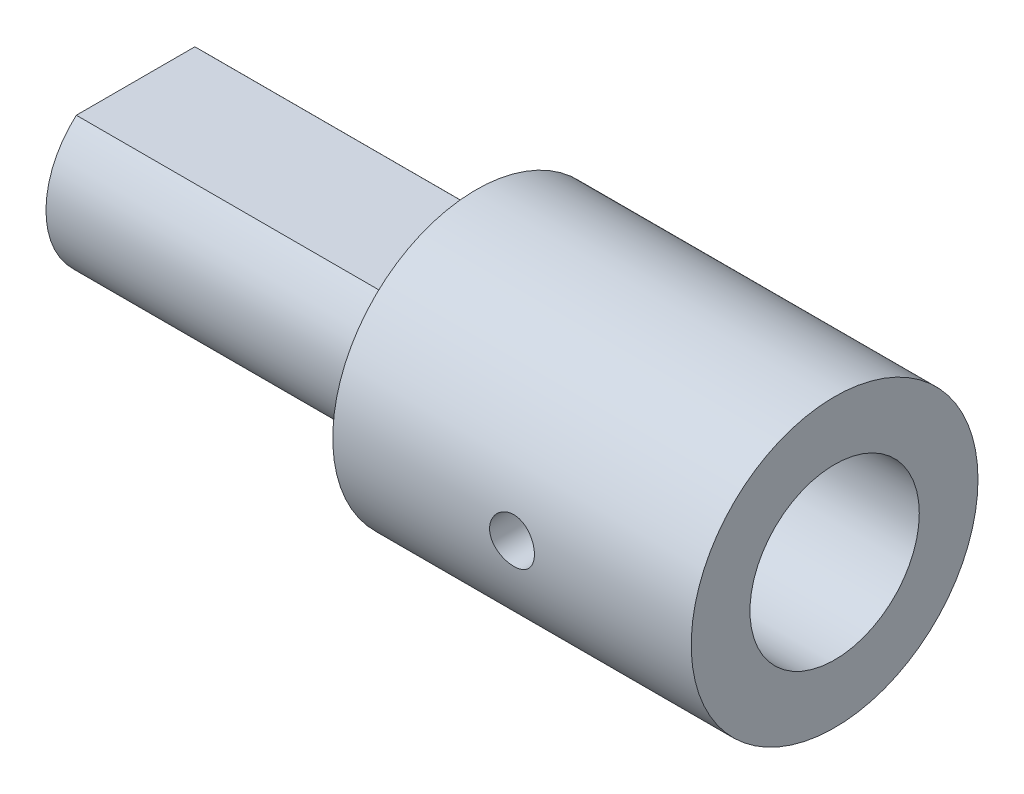
ISO-10303-21;
HEADER;
FILE_DESCRIPTION(('STEP AP214'),'2;1');
FILE_NAME('part.step','',(''),(''),'','','');
FILE_SCHEMA(('AUTOMOTIVE_DESIGN { 1 0 10303 214 1 1 1 1 }'));
ENDSEC;
DATA;
#1=APPLICATION_CONTEXT('core data for automotive mechanical design processes');
#2=APPLICATION_PROTOCOL_DEFINITION('international standard','automotive_design',2000,#1);
#3=PRODUCT_CONTEXT('',#1,'mechanical');
#4=PRODUCT('Part','Part','',(#3));
#5=PRODUCT_RELATED_PRODUCT_CATEGORY('part','',(#4));
#6=PRODUCT_DEFINITION_FORMATION('','',#4);
#7=PRODUCT_DEFINITION_CONTEXT('part definition',#1,'design');
#8=PRODUCT_DEFINITION('design','',#6,#7);
#9=PRODUCT_DEFINITION_SHAPE('','',#8);
#10=(LENGTH_UNIT() NAMED_UNIT(*) SI_UNIT(.MILLI.,.METRE.));
#11=(NAMED_UNIT(*) PLANE_ANGLE_UNIT() SI_UNIT($,.RADIAN.));
#12=(NAMED_UNIT(*) SI_UNIT($,.STERADIAN.) SOLID_ANGLE_UNIT());
#13=UNCERTAINTY_MEASURE_WITH_UNIT(LENGTH_MEASURE(1.E-05),#10,'distance_accuracy_value','');
#14=(GEOMETRIC_REPRESENTATION_CONTEXT(3) GLOBAL_UNCERTAINTY_ASSIGNED_CONTEXT((#13)) GLOBAL_UNIT_ASSIGNED_CONTEXT((#10,
#11,#12)) REPRESENTATION_CONTEXT('',''));
#15=CARTESIAN_POINT('',(0.,0.,0.));
#16=DIRECTION('',(0.,0.,1.));
#17=DIRECTION('',(1.,0.,0.));
#18=AXIS2_PLACEMENT_3D('',#15,#16,#17);
#19=CARTESIAN_POINT('',(12.7,0.,0.));
#20=DIRECTION('',(-1.,0.,0.));
#21=DIRECTION('',(0.,0.,1.));
#22=AXIS2_PLACEMENT_3D('',#19,#20,#21);
#23=CYLINDRICAL_SURFACE('',#22,5.08);
#24=CARTESIAN_POINT('',(12.7,0.,0.));
#25=DIRECTION('',(1.,0.,0.));
#26=DIRECTION('',(0.,0.,-1.));
#27=AXIS2_PLACEMENT_3D('',#24,#25,#26);
#28=CIRCLE('',#27,5.08);
#29=CARTESIAN_POINT('',(12.7,0.,-5.08));
#30=VERTEX_POINT('',#29);
#31=EDGE_CURVE('E53',#30,#30,#28,.T.);
#32=ORIENTED_EDGE('',*,*,#31,.F.);
#33=EDGE_LOOP('',(#32));
#34=FACE_BOUND('',#33,.T.);
#35=CARTESIAN_POINT('',(0.,0.,0.));
#36=DIRECTION('',(1.,0.,0.));
#37=DIRECTION('',(0.,0.,-1.));
#38=AXIS2_PLACEMENT_3D('',#35,#36,#37);
#39=CIRCLE('',#38,5.08);
#40=CARTESIAN_POINT('',(0.,0.,-5.08));
#41=VERTEX_POINT('',#40);
#42=EDGE_CURVE('E99',#41,#41,#39,.T.);
#43=ORIENTED_EDGE('',*,*,#42,.T.);
#44=EDGE_LOOP('',(#43));
#45=FACE_BOUND('',#44,.T.);
#46=CARTESIAN_POINT('',(5.55625,0.,-5.08));
#47=CARTESIAN_POINT('',(5.55625180920121,0.044296043383553,-5.07999927036749));
#48=CARTESIAN_POINT('',(5.5599705011231,0.0886172360448611,-5.07941456964222));
#49=CARTESIAN_POINT('',(5.57474237198037,0.176019242505547,-5.07713836645986));
#50=CARTESIAN_POINT('',(5.58580254836986,0.219098831970153,-5.075445808082));
#51=CARTESIAN_POINT('',(5.6149175429411,0.302740230830051,-5.07114396350134));
#52=CARTESIAN_POINT('',(5.63296691583231,0.343303971852044,-5.06853539111307));
#53=CARTESIAN_POINT('',(5.67553428808246,0.42082124720666,-5.06268924607114));
#54=CARTESIAN_POINT('',(5.70005144691391,0.457775249791938,-5.0594517551636));
#55=CARTESIAN_POINT('',(5.75507899285238,0.527342071949389,-5.05267680221558));
#56=CARTESIAN_POINT('',(5.78563327087765,0.55991997462779,-5.04913725817067));
#57=CARTESIAN_POINT('',(5.85177326857537,0.619508441012464,-5.04217329171366));
#58=CARTESIAN_POINT('',(5.88735928739281,0.64651867347706,-5.03874887616113));
#59=CARTESIAN_POINT('',(5.96278915115163,0.694342478244206,-5.03238270930464));
#60=CARTESIAN_POINT('',(6.00265483564987,0.715121993546623,-5.02944364882088));
#61=CARTESIAN_POINT('',(6.08536419794735,0.749676814070682,-5.02440956553201));
#62=CARTESIAN_POINT('',(6.1282076992721,0.763452533956951,-5.02231449275954));
#63=CARTESIAN_POINT('',(6.21528821111315,0.78349970084788,-5.01922616457254));
#64=CARTESIAN_POINT('',(6.25951109849747,0.789831114922799,-5.01822410924025));
#65=CARTESIAN_POINT('',(6.34840208247341,0.794995773980448,-5.01740859315288));
#66=CARTESIAN_POINT('',(6.39307015118047,0.79382948568198,-5.01759505841447));
#67=CARTESIAN_POINT('',(6.48115830761323,0.784080794068226,-5.01912747269528));
#68=CARTESIAN_POINT('',(6.52458601841462,0.775565387397026,-5.0204629466872));
#69=CARTESIAN_POINT('',(6.60938861201909,0.751465152622161,-5.02412652889688));
#70=CARTESIAN_POINT('',(6.65076343220337,0.735880109022119,-5.02645466737286));
#71=CARTESIAN_POINT('',(6.730488416275,0.698013961314295,-5.03185273426342));
#72=CARTESIAN_POINT('',(6.76882497888795,0.675704682101867,-5.034925773052));
#73=CARTESIAN_POINT('',(6.84123585258016,0.625043384615573,-5.04146517152656));
#74=CARTESIAN_POINT('',(6.87530986025177,0.596690936578328,-5.04493155917757));
#75=CARTESIAN_POINT('',(6.93861650330608,0.534381357010907,-5.05191327134025));
#76=CARTESIAN_POINT('',(6.96779250275055,0.500366666779711,-5.055428718293));
#77=CARTESIAN_POINT('',(7.02003077374067,0.427893780792947,-5.06207752297935));
#78=CARTESIAN_POINT('',(7.04309301422929,0.389435562466319,-5.06521087877192));
#79=CARTESIAN_POINT('',(7.08245283831161,0.309116706840436,-5.07074614191084));
#80=CARTESIAN_POINT('',(7.09874582233423,0.267253779131346,-5.07314755162064));
#81=CARTESIAN_POINT('',(7.1240541946645,0.181339977266221,-5.07694425300215));
#82=CARTESIAN_POINT('',(7.13307011726611,0.137289263993186,-5.0783396185385));
#83=CARTESIAN_POINT('',(7.14349259527294,0.0487388969224856,-5.07995717473411));
#84=CARTESIAN_POINT('',(7.14497697207494,0.00424861402901249,-5.08019136294233));
#85=CARTESIAN_POINT('',(7.14050111605583,-0.0843453184856967,-5.07949290960978));
#86=CARTESIAN_POINT('',(7.13454113392796,-0.128448981076237,-5.07856030736137));
#87=CARTESIAN_POINT('',(7.11541046191154,-0.214780319189361,-5.07564048272598));
#88=CARTESIAN_POINT('',(7.10227790924999,-0.257016650702793,-5.07365883988385));
#89=CARTESIAN_POINT('',(7.06921525752838,-0.338688066544479,-5.0688623402953));
#90=CARTESIAN_POINT('',(7.04928481604445,-0.378123009640012,-5.06604744157698));
#91=CARTESIAN_POINT('',(7.00301114281731,-0.453412924214505,-5.0598672384525));
#92=CARTESIAN_POINT('',(6.97661881912127,-0.489237376801332,-5.05649778850636));
#93=CARTESIAN_POINT('',(6.91823861272428,-0.555976461412284,-5.04959582047458));
#94=CARTESIAN_POINT('',(6.88625037555246,-0.586890782169281,-5.04606329206925));
#95=CARTESIAN_POINT('',(6.81723896988353,-0.643217156465993,-5.03919498742886));
#96=CARTESIAN_POINT('',(6.78017286103866,-0.668576890504601,-5.0358612807808));
#97=CARTESIAN_POINT('',(6.70226114661253,-0.712709927532083,-5.0298054496585));
#98=CARTESIAN_POINT('',(6.66141564987209,-0.731483420120483,-5.02708330757984));
#99=CARTESIAN_POINT('',(6.57725708907324,-0.761831000925358,-5.02257400154373));
#100=CARTESIAN_POINT('',(6.53395395366691,-0.773432079459621,-5.02078333645795));
#101=CARTESIAN_POINT('',(6.44598369688669,-0.7891910874787,-5.01833061064152));
#102=CARTESIAN_POINT('',(6.40131667872947,-0.793349578794866,-5.01766846472059));
#103=CARTESIAN_POINT('',(6.31240840769938,-0.794091162293151,-5.01755110929251));
#104=CARTESIAN_POINT('',(6.26816783672361,-0.79075654824125,-5.01808278843621));
#105=CARTESIAN_POINT('',(6.18088511815669,-0.776783508837485,-5.02026459414031));
#106=CARTESIAN_POINT('',(6.13784296797071,-0.766145099301102,-5.02191471827885));
#107=CARTESIAN_POINT('',(6.05420499004163,-0.737896447406629,-5.02614275711433));
#108=CARTESIAN_POINT('',(6.01360701065295,-0.720292443519994,-5.02871984142707));
#109=CARTESIAN_POINT('',(5.93592741765778,-0.678620590134874,-5.03451235935048));
#110=CARTESIAN_POINT('',(5.89884594349342,-0.654552484456312,-5.03772781825938));
#111=CARTESIAN_POINT('',(5.82883468973973,-0.600338550841577,-5.04447672869293));
#112=CARTESIAN_POINT('',(5.79595227757511,-0.570131915025889,-5.04801314868392));
#113=CARTESIAN_POINT('',(5.73569425744721,-0.504626862976297,-5.05498113855933));
#114=CARTESIAN_POINT('',(5.70831992744708,-0.469327268349022,-5.05841268395489));
#115=CARTESIAN_POINT('',(5.65970698668748,-0.394387977682784,-5.06480795030002));
#116=CARTESIAN_POINT('',(5.63850619414882,-0.354723500655205,-5.0677687393161));
#117=CARTESIAN_POINT('',(5.60309998370874,-0.272367972648596,-5.07286024998845));
#118=CARTESIAN_POINT('',(5.58888742121271,-0.229680064064709,-5.07499181895123));
#119=CARTESIAN_POINT('',(5.57103501580374,-0.155674771171931,-5.077705890621));
#120=CARTESIAN_POINT('',(5.56549925422529,-0.12481102026939,-5.07856169841294));
#121=CARTESIAN_POINT('',(5.55810613250214,-0.0626357008175593,-5.07970900711495));
#122=CARTESIAN_POINT('',(5.55624872061555,-0.0313241385736949,-5.08000051596279));
#123=CARTESIAN_POINT('',(5.55625,0.,-5.08));
#124=B_SPLINE_CURVE_WITH_KNOTS('',3,(#46,#47,#48,#49,#50,#51,#52,#53,#54,#55,#56,#57,#58,#59,
#60,#61,#62,#63,#64,#65,#66,#67,#68,#69,#70,#71,#72,#73,#74,#75,#76,#77,#78,#79,#80,#81,#82,#83,
#84,#85,#86,#87,#88,#89,#90,#91,#92,#93,#94,#95,#96,#97,#98,#99,#100,#101,#102,#103,#104,#105,
#106,#107,#108,#109,#110,#111,#112,#113,#114,#115,#116,#117,#118,#119,#120,#121,#122,#123),
.UNSPECIFIED.,.T.,.F.,(4,2,2,2,2,2,2,2,2,2,2,2,2,2,2,2,2,2,2,2,2,2,2,2,2,2,2,2,2,2,2,2,2,2,2,2,
2,2,4),(0.,0.132773655101603,0.265674044002645,0.398471097722526,0.531250902164696,
0.665034128883234,0.798825312574214,0.933334997073286,1.06783671690433,1.20124737885361,
1.33464973630398,1.46684865387169,1.59905160139209,1.73181637825245,1.86459059990732,
1.99880770016161,2.1330254822064,2.26733431392074,2.40163328355982,2.53454171146878,
2.66744566372753,2.7996497371021,2.93186047085595,3.06510861916621,3.1983652110845,
3.33282759979245,3.46728611738551,3.60123552800454,3.73517482652801,3.86765032157584,
4.000125529765,4.13248235911901,4.26484443470653,4.39858788910184,4.5323623384268,
4.6669398158345,4.80137941695869,4.89527220191614,4.9891636661114),.UNSPECIFIED.);
#125=CARTESIAN_POINT('',(5.55625,0.,-5.08));
#126=VERTEX_POINT('',#125);
#127=EDGE_CURVE('E91',#126,#126,#124,.T.);
#128=ORIENTED_EDGE('',*,*,#127,.F.);
#129=EDGE_LOOP('',(#128));
#130=FACE_BOUND('',#129,.T.);
#131=CARTESIAN_POINT('',(7.14375,0.,5.08));
#132=CARTESIAN_POINT('',(7.14374819079879,0.044296043383553,5.07999927036749));
#133=CARTESIAN_POINT('',(7.14002949887689,0.0886172360448612,5.07941456964222));
#134=CARTESIAN_POINT('',(7.12525762801963,0.176019242505547,5.07713836645986));
#135=CARTESIAN_POINT('',(7.11419745163013,0.219098831970153,5.075445808082));
#136=CARTESIAN_POINT('',(7.0850824570589,0.302740230830051,5.07114396350134));
#137=CARTESIAN_POINT('',(7.06703308416769,0.343303971852044,5.06853539111307));
#138=CARTESIAN_POINT('',(7.02446571191754,0.42082124720666,5.06268924607114));
#139=CARTESIAN_POINT('',(6.99994855308609,0.457775249791937,5.0594517551636));
#140=CARTESIAN_POINT('',(6.94492100714762,0.527342071949389,5.05267680221558));
#141=CARTESIAN_POINT('',(6.91436672912235,0.55991997462779,5.04913725817067));
#142=CARTESIAN_POINT('',(6.84822673142463,0.619508441012464,5.04217329171366));
#143=CARTESIAN_POINT('',(6.81264071260719,0.64651867347706,5.03874887616113));
#144=CARTESIAN_POINT('',(6.73721084884837,0.694342478244206,5.03238270930464));
#145=CARTESIAN_POINT('',(6.69734516435013,0.715121993546623,5.02944364882088));
#146=CARTESIAN_POINT('',(6.61463580205265,0.749676814070682,5.02440956553201));
#147=CARTESIAN_POINT('',(6.5717923007279,0.763452533956951,5.02231449275954));
#148=CARTESIAN_POINT('',(6.48471178888685,0.78349970084788,5.01922616457254));
#149=CARTESIAN_POINT('',(6.44048890150253,0.789831114922799,5.01822410924025));
#150=CARTESIAN_POINT('',(6.35159791752658,0.794995773980448,5.01740859315288));
#151=CARTESIAN_POINT('',(6.30692984881953,0.79382948568198,5.01759505841447));
#152=CARTESIAN_POINT('',(6.21884169238677,0.784080794068226,5.01912747269528));
#153=CARTESIAN_POINT('',(6.17541398158538,0.775565387397026,5.0204629466872));
#154=CARTESIAN_POINT('',(6.09061138798092,0.751465152622161,5.02412652889688));
#155=CARTESIAN_POINT('',(6.04923656779663,0.73588010902212,5.02645466737286));
#156=CARTESIAN_POINT('',(5.969511583725,0.698013961314296,5.03185273426342));
#157=CARTESIAN_POINT('',(5.93117502111205,0.675704682101868,5.034925773052));
#158=CARTESIAN_POINT('',(5.85876414741984,0.625043384615573,5.04146517152656));
#159=CARTESIAN_POINT('',(5.82469013974823,0.596690936578328,5.04493155917757));
#160=CARTESIAN_POINT('',(5.76138349669392,0.534381357010907,5.05191327134025));
#161=CARTESIAN_POINT('',(5.73220749724945,0.500366666779712,5.055428718293));
#162=CARTESIAN_POINT('',(5.67996922625933,0.427893780792947,5.06207752297935));
#163=CARTESIAN_POINT('',(5.65690698577071,0.389435562466319,5.06521087877192));
#164=CARTESIAN_POINT('',(5.61754716168839,0.309116706840436,5.07074614191084));
#165=CARTESIAN_POINT('',(5.60125417766577,0.267253779131346,5.07314755162064));
#166=CARTESIAN_POINT('',(5.5759458053355,0.181339977266221,5.07694425300215));
#167=CARTESIAN_POINT('',(5.56692988273389,0.137289263993186,5.0783396185385));
#168=CARTESIAN_POINT('',(5.55650740472706,0.0487388969224857,5.07995717473411));
#169=CARTESIAN_POINT('',(5.55502302792506,0.00424861402901268,5.08019136294233));
#170=CARTESIAN_POINT('',(5.55949888394417,-0.0843453184856964,5.07949290960978));
#171=CARTESIAN_POINT('',(5.56545886607204,-0.128448981076237,5.07856030736137));
#172=CARTESIAN_POINT('',(5.58458953808846,-0.214780319189361,5.07564048272598));
#173=CARTESIAN_POINT('',(5.59772209075,-0.257016650702793,5.07365883988385));
#174=CARTESIAN_POINT('',(5.63078474247162,-0.338688066544479,5.0688623402953));
#175=CARTESIAN_POINT('',(5.65071518395555,-0.378123009640012,5.06604744157698));
#176=CARTESIAN_POINT('',(5.69698885718269,-0.453412924214504,5.0598672384525));
#177=CARTESIAN_POINT('',(5.72338118087873,-0.489237376801332,5.05649778850636));
#178=CARTESIAN_POINT('',(5.78176138727572,-0.555976461412284,5.04959582047458));
#179=CARTESIAN_POINT('',(5.81374962444754,-0.586890782169281,5.04606329206925));
#180=CARTESIAN_POINT('',(5.88276103011646,-0.643217156465993,5.03919498742886));
#181=CARTESIAN_POINT('',(5.91982713896134,-0.668576890504601,5.0358612807808));
#182=CARTESIAN_POINT('',(5.99773885338747,-0.712709927532083,5.0298054496585));
#183=CARTESIAN_POINT('',(6.03858435012791,-0.731483420120483,5.02708330757984));
#184=CARTESIAN_POINT('',(6.12274291092676,-0.761831000925358,5.02257400154373));
#185=CARTESIAN_POINT('',(6.16604604633309,-0.773432079459621,5.02078333645795));
#186=CARTESIAN_POINT('',(6.25401630311331,-0.7891910874787,5.01833061064152));
#187=CARTESIAN_POINT('',(6.29868332127054,-0.793349578794866,5.01766846472059));
#188=CARTESIAN_POINT('',(6.38759159230062,-0.79409116229315,5.01755110929251));
#189=CARTESIAN_POINT('',(6.43183216327639,-0.79075654824125,5.01808278843621));
#190=CARTESIAN_POINT('',(6.51911488184331,-0.776783508837485,5.02026459414031));
#191=CARTESIAN_POINT('',(6.56215703202929,-0.766145099301102,5.02191471827885));
#192=CARTESIAN_POINT('',(6.64579500995836,-0.737896447406629,5.02614275711433));
#193=CARTESIAN_POINT('',(6.68639298934705,-0.720292443519994,5.02871984142707));
#194=CARTESIAN_POINT('',(6.76407258234222,-0.678620590134874,5.03451235935048));
#195=CARTESIAN_POINT('',(6.80115405650658,-0.654552484456312,5.03772781825938));
#196=CARTESIAN_POINT('',(6.87116531026027,-0.600338550841577,5.04447672869293));
#197=CARTESIAN_POINT('',(6.90404772242489,-0.570131915025889,5.04801314868392));
#198=CARTESIAN_POINT('',(6.96430574255279,-0.504626862976297,5.05498113855933));
#199=CARTESIAN_POINT('',(6.99168007255292,-0.469327268349023,5.05841268395489));
#200=CARTESIAN_POINT('',(7.04029301331252,-0.394387977682784,5.06480795030002));
#201=CARTESIAN_POINT('',(7.06149380585118,-0.354723500655206,5.0677687393161));
#202=CARTESIAN_POINT('',(7.09690001629126,-0.272367972648596,5.07286024998845));
#203=CARTESIAN_POINT('',(7.11111257878729,-0.229680064064709,5.07499181895123));
#204=CARTESIAN_POINT('',(7.12896498419626,-0.155674771171931,5.077705890621));
#205=CARTESIAN_POINT('',(7.13450074577471,-0.124811020269391,5.07856169841294));
#206=CARTESIAN_POINT('',(7.14189386749786,-0.0626357008175595,5.07970900711495));
#207=CARTESIAN_POINT('',(7.14375127938445,-0.031324138573695,5.08000051596279));
#208=CARTESIAN_POINT('',(7.14375,0.,5.08));
#209=B_SPLINE_CURVE_WITH_KNOTS('',3,(#131,#132,#133,#134,#135,#136,#137,#138,#139,#140,#141,
#142,#143,#144,#145,#146,#147,#148,#149,#150,#151,#152,#153,#154,#155,#156,#157,#158,#159,#160,
#161,#162,#163,#164,#165,#166,#167,#168,#169,#170,#171,#172,#173,#174,#175,#176,#177,#178,#179,
#180,#181,#182,#183,#184,#185,#186,#187,#188,#189,#190,#191,#192,#193,#194,#195,#196,#197,#198,
#199,#200,#201,#202,#203,#204,#205,#206,#207,#208),.UNSPECIFIED.,.T.,.F.,(4,2,2,2,2,2,2,2,2,2,2,
2,2,2,2,2,2,2,2,2,2,2,2,2,2,2,2,2,2,2,2,2,2,2,2,2,2,2,4),(0.,0.132773655101604,
0.265674044002644,0.398471097722526,0.531250902164695,0.665034128883233,0.798825312574213,
0.933334997073285,1.06783671690433,1.20124737885361,1.33464973630398,1.46684865387169,
1.59905160139208,1.73181637825245,1.86459059990732,1.99880770016161,2.1330254822064,
2.26733431392074,2.40163328355982,2.53454171146878,2.66744566372753,2.7996497371021,
2.93186047085595,3.06510861916621,3.19836521108449,3.33282759979245,3.46728611738551,
3.60123552800454,3.73517482652801,3.86765032157584,4.00012552976499,4.13248235911901,
4.26484443470653,4.39858788910184,4.5323623384268,4.6669398158345,4.80137941695869,
4.89527220191614,4.9891636661114),.UNSPECIFIED.);
#210=CARTESIAN_POINT('',(7.14375,0.,5.08));
#211=VERTEX_POINT('',#210);
#212=EDGE_CURVE('E85',#211,#211,#209,.T.);
#213=ORIENTED_EDGE('',*,*,#212,.F.);
#214=EDGE_LOOP('',(#213));
#215=FACE_BOUND('',#214,.T.);
#216=ADVANCED_FACE('F39',(#34,#45,#130,#215),#23,.T.);
#217=CARTESIAN_POINT('',(3.158744,0.,0.));
#218=DIRECTION('',(1.,0.,0.));
#219=DIRECTION('',(0.,0.,-1.));
#220=AXIS2_PLACEMENT_3D('',#217,#218,#219);
#221=CYLINDRICAL_SURFACE('',#220,2.999994);
#222=CARTESIAN_POINT('',(3.158744,0.,0.));
#223=DIRECTION('',(1.,0.,0.));
#224=DIRECTION('',(0.,0.,-1.));
#225=AXIS2_PLACEMENT_3D('',#222,#223,#224);
#226=CIRCLE('',#225,2.999994);
#227=CARTESIAN_POINT('',(3.158744,0.,-2.999994));
#228=VERTEX_POINT('',#227);
#229=EDGE_CURVE('E88',#228,#228,#226,.T.);
#230=ORIENTED_EDGE('',*,*,#229,.F.);
#231=EDGE_LOOP('',(#230));
#232=FACE_BOUND('',#231,.T.);
#233=CARTESIAN_POINT('',(12.7,0.,0.));
#234=DIRECTION('',(1.,0.,0.));
#235=DIRECTION('',(0.,0.,-1.));
#236=AXIS2_PLACEMENT_3D('',#233,#234,#235);
#237=CIRCLE('',#236,2.999994);
#238=CARTESIAN_POINT('',(12.7,0.,-2.999994));
#239=VERTEX_POINT('',#238);
#240=EDGE_CURVE('E84',#239,#239,#237,.T.);
#241=ORIENTED_EDGE('',*,*,#240,.T.);
#242=EDGE_LOOP('',(#241));
#243=FACE_BOUND('',#242,.T.);
#244=CARTESIAN_POINT('',(5.55625,0.,2.999994));
#245=CARTESIAN_POINT('',(5.55625106465804,0.0437698343876581,2.99999332822944));
#246=CARTESIAN_POINT('',(5.55988254946458,0.0875511375503751,2.99902665718826));
#247=CARTESIAN_POINT('',(5.57428733745207,0.173853354841968,2.99526426791833));
#248=CARTESIAN_POINT('',(5.58506415558185,0.216373637886627,2.99246764950653));
#249=CARTESIAN_POINT('',(5.61338533498128,0.298895534971637,2.98535416780944));
#250=CARTESIAN_POINT('',(5.63092104685117,0.338900292350397,2.98103924811612));
#251=CARTESIAN_POINT('',(5.67223038299155,0.415400922118462,2.97134562505494));
#252=CARTESIAN_POINT('',(5.69600439713904,0.451896575003376,2.96596685520452));
#253=CARTESIAN_POINT('',(5.7496892028934,0.521177160861767,2.95458920610509));
#254=CARTESIAN_POINT('',(5.77971603020188,0.553870461930971,2.94857985780222));
#255=CARTESIAN_POINT('',(5.84480601295341,0.613821027473368,2.93668586148387));
#256=CARTESIAN_POINT('',(5.87986980516324,0.641077603600475,2.93080122934295));
#257=CARTESIAN_POINT('',(5.95476724402217,0.689825755857821,2.91971605484281));
#258=CARTESIAN_POINT('',(5.9946713946475,0.711212290266212,2.91452873166006));
#259=CARTESIAN_POINT('',(6.07766836619235,0.746936836031448,2.90557926803191));
#260=CARTESIAN_POINT('',(6.12076060767194,0.761276124631699,2.90181686936144));
#261=CARTESIAN_POINT('',(6.20789663386639,0.782181625812209,2.89625127268942));
#262=CARTESIAN_POINT('',(6.25189787032209,0.788913797567134,2.89440631820569));
#263=CARTESIAN_POINT('',(6.3404409112413,0.794931306071651,2.89275971527182));
#264=CARTESIAN_POINT('',(6.38498261489509,0.794218010879066,2.89295769144593));
#265=CARTESIAN_POINT('',(6.47204988100888,0.785496672330232,2.89533718831552));
#266=CARTESIAN_POINT('',(6.51459724504645,0.777689050284633,2.89746420862135));
#267=CARTESIAN_POINT('',(6.59775555375415,0.755321523518437,2.90337491900023));
#268=CARTESIAN_POINT('',(6.63836634553002,0.740761086626718,2.90715873963993));
#269=CARTESIAN_POINT('',(6.71702306018244,0.705136977835531,2.91600490122621));
#270=CARTESIAN_POINT('',(6.75503540441127,0.684002726997189,2.92108100369186));
#271=CARTESIAN_POINT('',(6.82704474727299,0.635880167921664,2.93193233507327));
#272=CARTESIAN_POINT('',(6.86104096464763,0.608890723558934,2.93770769957567));
#273=CARTESIAN_POINT('',(6.92519856105347,0.548797422769156,2.94953401104792));
#274=CARTESIAN_POINT('',(6.95520188324837,0.515525155991986,2.95558785435231));
#275=CARTESIAN_POINT('',(7.00923499184325,0.444347564169448,2.96712270428321));
#276=CARTESIAN_POINT('',(7.03326455001538,0.40644206219368,2.972603689019));
#277=CARTESIAN_POINT('',(7.07473611311596,0.326831702122514,2.98240811594882));
#278=CARTESIAN_POINT('',(7.09214989154592,0.285111486243936,2.98672657586602));
#279=CARTESIAN_POINT('',(7.11967120772692,0.199195455930693,2.99368334214618));
#280=CARTESIAN_POINT('',(7.12978031636278,0.155000175967953,2.99632200973751));
#281=CARTESIAN_POINT('',(7.14215803359275,0.066737762443701,2.99956740695457));
#282=CARTESIAN_POINT('',(7.14464157763479,0.0227027731406188,3.00022982386185));
#283=CARTESIAN_POINT('',(7.142290717585,-0.0651543981732737,2.99960799559473));
#284=CARTESIAN_POINT('',(7.13745705722824,-0.108976601357916,2.99832394826276));
#285=CARTESIAN_POINT('',(7.12078541111469,-0.194399708813835,2.99398940155453));
#286=CARTESIAN_POINT('',(7.10906697246559,-0.23602561561469,2.99096906980475));
#287=CARTESIAN_POINT('',(7.0790969454627,-0.316717003965162,2.98350426240148));
#288=CARTESIAN_POINT('',(7.06084465485578,-0.355782209758529,2.97905963367108));
#289=CARTESIAN_POINT('',(7.01792408066594,-0.431081005750425,2.96910839235786));
#290=CARTESIAN_POINT('',(6.99313842600533,-0.467245134931729,2.96358288587735));
#291=CARTESIAN_POINT('',(6.93800256612171,-0.53497645123567,2.95210878065002));
#292=CARTESIAN_POINT('',(6.90765127950869,-0.566542742866242,2.94616009981907));
#293=CARTESIAN_POINT('',(6.84124329066759,-0.625085500454536,2.93430577386352));
#294=CARTESIAN_POINT('',(6.80505172062974,-0.651910424893503,2.92840589594278));
#295=CARTESIAN_POINT('',(6.72855643976503,-0.699109073469396,2.91749885148153));
#296=CARTESIAN_POINT('',(6.68825290260094,-0.719483069902605,2.91249164726481));
#297=CARTESIAN_POINT('',(6.60488128009743,-0.753048141388213,2.90399421782314));
#298=CARTESIAN_POINT('',(6.56183096443205,-0.766281006144706,2.90049519158949));
#299=CARTESIAN_POINT('',(6.47400813407466,-0.785288634727641,2.89540746962536));
#300=CARTESIAN_POINT('',(6.42923605406846,-0.79106526842878,2.89381829494893));
#301=CARTESIAN_POINT('',(6.34079085854109,-0.794890139086496,2.89276977431597));
#302=CARTESIAN_POINT('',(6.29712890472394,-0.793181763090899,2.89324335169416));
#303=CARTESIAN_POINT('',(6.21073948740781,-0.782648714868499,2.89611017977798));
#304=CARTESIAN_POINT('',(6.1680120005944,-0.773824220393356,2.89850338253378));
#305=CARTESIAN_POINT('',(6.08500536831942,-0.749449515163832,2.90490020182887));
#306=CARTESIAN_POINT('',(6.04471029662855,-0.733950118843821,2.90889163560954));
#307=CARTESIAN_POINT('',(5.96726220501426,-0.696705119752811,2.91803564981323));
#308=CARTESIAN_POINT('',(5.93010967204659,-0.67495855123081,2.92318840973923));
#309=CARTESIAN_POINT('',(5.85883767599514,-0.625095623779107,2.93426116924666));
#310=CARTESIAN_POINT('',(5.82483743070673,-0.596812816510113,2.94019908652472));
#311=CARTESIAN_POINT('',(5.76198650822279,-0.534997815730458,2.95207218116352));
#312=CARTESIAN_POINT('',(5.73313708089121,-0.501464351824795,2.95800735751161));
#313=CARTESIAN_POINT('',(5.68081292921618,-0.429251781295606,2.96935495483386));
#314=CARTESIAN_POINT('',(5.65746353198043,-0.390479554454871,2.97475381150306));
#315=CARTESIAN_POINT('',(5.61765105970178,-0.309418885510397,2.98427280211951));
#316=CARTESIAN_POINT('',(5.60118349906147,-0.267132755396145,2.9883937685453));
#317=CARTESIAN_POINT('',(5.57778831865734,-0.187494037702401,2.9943498961615));
#318=CARTESIAN_POINT('',(5.56973003927345,-0.150489531691145,2.99645112605472));
#319=CARTESIAN_POINT('',(5.55896067509434,-0.0756594876383261,2.99927340241547));
#320=CARTESIAN_POINT('',(5.55624907972459,-0.0378340283414092,2.99999458066901));
#321=CARTESIAN_POINT('',(5.55625,0.,2.999994));
#322=B_SPLINE_CURVE_WITH_KNOTS('',3,(#244,#245,#246,#247,#248,#249,#250,#251,#252,#253,#254,
#255,#256,#257,#258,#259,#260,#261,#262,#263,#264,#265,#266,#267,#268,#269,#270,#271,#272,#273,
#274,#275,#276,#277,#278,#279,#280,#281,#282,#283,#284,#285,#286,#287,#288,#289,#290,#291,#292,
#293,#294,#295,#296,#297,#298,#299,#300,#301,#302,#303,#304,#305,#306,#307,#308,#309,#310,#311,
#312,#313,#314,#315,#316,#317,#318,#319,#320,#321),.UNSPECIFIED.,.T.,.F.,(4,2,2,2,2,2,2,2,2,2,2,
2,2,2,2,2,2,2,2,2,2,2,2,2,2,2,2,2,2,2,2,2,2,2,2,2,2,2,4),(0.,0.13117076886442,0.262406111477294,
0.393474066005081,0.524550213876923,0.658319081135199,0.792104874191874,0.928148214667912,
1.0641668895367,1.19715710754486,1.33012288986535,1.4594452339308,1.58877777127356,
1.71954981397892,1.85034725406123,1.9853417373357,2.1203413772865,2.25591069774201,
2.3914508550422,2.52313385834581,2.65480347802827,2.78425167519728,2.91371378953343,
3.04568225837147,3.17767639561294,3.31333057750586,3.4489790326172,3.58382482318628,
3.71863679053417,3.8490982437508,3.97955643830587,4.10903857076639,4.23854073066482,
4.37179878989752,4.5050891408458,4.64117324047346,4.77716850129289,4.89056149518239,
5.00394366023303),.UNSPECIFIED.);
#323=CARTESIAN_POINT('',(5.55625,0.,2.999994));
#324=VERTEX_POINT('',#323);
#325=EDGE_CURVE('E104',#324,#324,#322,.T.);
#326=ORIENTED_EDGE('',*,*,#325,.F.);
#327=EDGE_LOOP('',(#326));
#328=FACE_BOUND('',#327,.T.);
#329=CARTESIAN_POINT('',(5.55625,0.,-2.999994));
#330=CARTESIAN_POINT('',(5.55625106465804,-0.0437698343876582,-2.99999332822944));
#331=CARTESIAN_POINT('',(5.55988254946458,-0.0875511375503752,-2.99902665718826));
#332=CARTESIAN_POINT('',(5.57428733745206,-0.173853354841969,-2.99526426791833));
#333=CARTESIAN_POINT('',(5.58506415558185,-0.216373637886627,-2.99246764950653));
#334=CARTESIAN_POINT('',(5.61338533498128,-0.298895534971638,-2.98535416780944));
#335=CARTESIAN_POINT('',(5.63092104685117,-0.338900292350397,-2.98103924811612));
#336=CARTESIAN_POINT('',(5.67223038299155,-0.415400922118463,-2.97134562505494));
#337=CARTESIAN_POINT('',(5.69600439713904,-0.451896575003376,-2.96596685520452));
#338=CARTESIAN_POINT('',(5.74968920289341,-0.521177160861767,-2.95458920610509));
#339=CARTESIAN_POINT('',(5.77971603020188,-0.553870461930971,-2.94857985780222));
#340=CARTESIAN_POINT('',(5.84480601295341,-0.613821027473368,-2.93668586148387));
#341=CARTESIAN_POINT('',(5.87986980516324,-0.641077603600475,-2.93080122934295));
#342=CARTESIAN_POINT('',(5.95476724402217,-0.689825755857821,-2.91971605484281));
#343=CARTESIAN_POINT('',(5.9946713946475,-0.711212290266213,-2.91452873166006));
#344=CARTESIAN_POINT('',(6.07766836619235,-0.746936836031448,-2.90557926803191));
#345=CARTESIAN_POINT('',(6.12076060767194,-0.761276124631699,-2.90181686936144));
#346=CARTESIAN_POINT('',(6.20789663386639,-0.782181625812209,-2.89625127268942));
#347=CARTESIAN_POINT('',(6.25189787032209,-0.788913797567134,-2.89440631820569));
#348=CARTESIAN_POINT('',(6.3404409112413,-0.794931306071651,-2.89275971527182));
#349=CARTESIAN_POINT('',(6.38498261489509,-0.794218010879066,-2.89295769144593));
#350=CARTESIAN_POINT('',(6.47204988100888,-0.785496672330232,-2.89533718831552));
#351=CARTESIAN_POINT('',(6.51459724504645,-0.777689050284633,-2.89746420862135));
#352=CARTESIAN_POINT('',(6.59775555375415,-0.755321523518437,-2.90337491900023));
#353=CARTESIAN_POINT('',(6.63836634553002,-0.740761086626718,-2.90715873963993));
#354=CARTESIAN_POINT('',(6.71702306018244,-0.705136977835531,-2.91600490122621));
#355=CARTESIAN_POINT('',(6.75503540441127,-0.684002726997189,-2.92108100369186));
#356=CARTESIAN_POINT('',(6.82704474727299,-0.635880167921665,-2.93193233507327));
#357=CARTESIAN_POINT('',(6.86104096464763,-0.608890723558934,-2.93770769957567));
#358=CARTESIAN_POINT('',(6.92519856105347,-0.548797422769157,-2.94953401104792));
#359=CARTESIAN_POINT('',(6.95520188324837,-0.515525155991987,-2.95558785435231));
#360=CARTESIAN_POINT('',(7.00923499184325,-0.44434756416945,-2.9671227042832));
#361=CARTESIAN_POINT('',(7.03326455001538,-0.406442062193682,-2.972603689019));
#362=CARTESIAN_POINT('',(7.07473611311596,-0.326831702122514,-2.98240811594881));
#363=CARTESIAN_POINT('',(7.09214989154592,-0.285111486243936,-2.98672657586602));
#364=CARTESIAN_POINT('',(7.11967120772692,-0.199195455930694,-2.99368334214618));
#365=CARTESIAN_POINT('',(7.12978031636278,-0.155000175967953,-2.99632200973751));
#366=CARTESIAN_POINT('',(7.14215803359275,-0.0667377624437015,-2.99956740695457));
#367=CARTESIAN_POINT('',(7.14464157763479,-0.0227027731406191,-3.00022982386185));
#368=CARTESIAN_POINT('',(7.142290717585,0.0651543981732735,-2.99960799559473));
#369=CARTESIAN_POINT('',(7.13745705722824,0.108976601357915,-2.99832394826276));
#370=CARTESIAN_POINT('',(7.12078541111469,0.194399708813834,-2.99398940155453));
#371=CARTESIAN_POINT('',(7.10906697246559,0.23602561561469,-2.99096906980475));
#372=CARTESIAN_POINT('',(7.0790969454627,0.316717003965162,-2.98350426240148));
#373=CARTESIAN_POINT('',(7.06084465485578,0.35578220975853,-2.97905963367108));
#374=CARTESIAN_POINT('',(7.01792408066594,0.431081005750425,-2.96910839235786));
#375=CARTESIAN_POINT('',(6.99313842600533,0.467245134931728,-2.96358288587735));
#376=CARTESIAN_POINT('',(6.93800256612171,0.534976451235669,-2.95210878065002));
#377=CARTESIAN_POINT('',(6.90765127950869,0.566542742866243,-2.94616009981907));
#378=CARTESIAN_POINT('',(6.84124329066759,0.625085500454536,-2.93430577386352));
#379=CARTESIAN_POINT('',(6.80505172062974,0.651910424893504,-2.92840589594278));
#380=CARTESIAN_POINT('',(6.72855643976503,0.699109073469396,-2.91749885148153));
#381=CARTESIAN_POINT('',(6.68825290260094,0.719483069902606,-2.91249164726481));
#382=CARTESIAN_POINT('',(6.60488128009743,0.753048141388213,-2.90399421782314));
#383=CARTESIAN_POINT('',(6.56183096443205,0.766281006144705,-2.90049519158949));
#384=CARTESIAN_POINT('',(6.47400813407466,0.78528863472764,-2.89540746962536));
#385=CARTESIAN_POINT('',(6.42923605406846,0.79106526842878,-2.89381829494893));
#386=CARTESIAN_POINT('',(6.34079085854109,0.794890139086496,-2.89276977431597));
#387=CARTESIAN_POINT('',(6.29712890472394,0.793181763090899,-2.89324335169416));
#388=CARTESIAN_POINT('',(6.21073948740781,0.782648714868499,-2.89611017977798));
#389=CARTESIAN_POINT('',(6.1680120005944,0.773824220393356,-2.89850338253378));
#390=CARTESIAN_POINT('',(6.08500536831942,0.749449515163832,-2.90490020182887));
#391=CARTESIAN_POINT('',(6.04471029662855,0.73395011884382,-2.90889163560954));
#392=CARTESIAN_POINT('',(5.96726220501426,0.696705119752811,-2.91803564981323));
#393=CARTESIAN_POINT('',(5.93010967204659,0.67495855123081,-2.92318840973923));
#394=CARTESIAN_POINT('',(5.85883767599514,0.625095623779107,-2.93426116924666));
#395=CARTESIAN_POINT('',(5.82483743070673,0.596812816510113,-2.94019908652472));
#396=CARTESIAN_POINT('',(5.76198650822279,0.534997815730458,-2.95207218116352));
#397=CARTESIAN_POINT('',(5.73313708089121,0.501464351824795,-2.95800735751161));
#398=CARTESIAN_POINT('',(5.68081292921618,0.429251781295607,-2.96935495483386));
#399=CARTESIAN_POINT('',(5.65746353198043,0.390479554454871,-2.97475381150306));
#400=CARTESIAN_POINT('',(5.61765105970178,0.309418885510397,-2.98427280211951));
#401=CARTESIAN_POINT('',(5.60118349906148,0.267132755396145,-2.9883937685453));
#402=CARTESIAN_POINT('',(5.57778831865734,0.187494037702401,-2.9943498961615));
#403=CARTESIAN_POINT('',(5.56973003927345,0.150489531691146,-2.99645112605472));
#404=CARTESIAN_POINT('',(5.55896067509434,0.0756594876383264,-2.99927340241547));
#405=CARTESIAN_POINT('',(5.55624907972459,0.0378340283414093,-2.99999458066901));
#406=CARTESIAN_POINT('',(5.55625,0.,-2.999994));
#407=B_SPLINE_CURVE_WITH_KNOTS('',3,(#329,#330,#331,#332,#333,#334,#335,#336,#337,#338,#339,
#340,#341,#342,#343,#344,#345,#346,#347,#348,#349,#350,#351,#352,#353,#354,#355,#356,#357,#358,
#359,#360,#361,#362,#363,#364,#365,#366,#367,#368,#369,#370,#371,#372,#373,#374,#375,#376,#377,
#378,#379,#380,#381,#382,#383,#384,#385,#386,#387,#388,#389,#390,#391,#392,#393,#394,#395,#396,
#397,#398,#399,#400,#401,#402,#403,#404,#405,#406),.UNSPECIFIED.,.T.,.F.,(4,2,2,2,2,2,2,2,2,2,2,
2,2,2,2,2,2,2,2,2,2,2,2,2,2,2,2,2,2,2,2,2,2,2,2,2,2,2,4),(0.,0.13117076886442,0.262406111477295,
0.393474066005082,0.524550213876923,0.658319081135199,0.792104874191875,0.928148214667913,
1.0641668895367,1.19715710754486,1.33012288986535,1.4594452339308,1.58877777127356,
1.71954981397892,1.85034725406123,1.9853417373357,2.1203413772865,2.25591069774201,
2.3914508550422,2.52313385834581,2.65480347802827,2.78425167519728,2.91371378953343,
3.04568225837147,3.17767639561294,3.31333057750586,3.4489790326172,3.58382482318628,
3.71863679053417,3.8490982437508,3.97955643830588,4.10903857076639,4.23854073066482,
4.37179878989752,4.50508914084581,4.64117324047346,4.77716850129289,4.89056149518239,
5.00394366023304),.UNSPECIFIED.);
#408=CARTESIAN_POINT('',(5.55625,0.,-2.999994));
#409=VERTEX_POINT('',#408);
#410=EDGE_CURVE('E43',#409,#409,#407,.T.);
#411=ORIENTED_EDGE('',*,*,#410,.F.);
#412=EDGE_LOOP('',(#411));
#413=FACE_BOUND('',#412,.T.);
#414=ADVANCED_FACE('F109',(#232,#243,#328,#413),#221,.F.);
#415=CARTESIAN_POINT('',(12.7,0.,0.));
#416=DIRECTION('',(1.,0.,0.));
#417=DIRECTION('',(0.,0.,-1.));
#418=AXIS2_PLACEMENT_3D('',#415,#416,#417);
#419=PLANE('',#418);
#420=ORIENTED_EDGE('',*,*,#240,.F.);
#421=EDGE_LOOP('',(#420));
#422=FACE_BOUND('',#421,.T.);
#423=ORIENTED_EDGE('',*,*,#31,.T.);
#424=EDGE_LOOP('',(#423));
#425=FACE_BOUND('',#424,.T.);
#426=ADVANCED_FACE('F135',(#422,#425),#419,.T.);
#427=CARTESIAN_POINT('',(0.,0.,0.));
#428=DIRECTION('',(1.,0.,0.));
#429=DIRECTION('',(0.,0.,-1.));
#430=AXIS2_PLACEMENT_3D('',#427,#428,#429);
#431=PLANE('',#430);
#432=CARTESIAN_POINT('',(0.,0.,0.));
#433=DIRECTION('',(-1.,0.,0.));
#434=DIRECTION('',(0.,0.,1.));
#435=AXIS2_PLACEMENT_3D('',#432,#433,#434);
#436=CIRCLE('',#435,3.175);
#437=CARTESIAN_POINT('',(0.,2.38125,-2.10006510315752));
#438=VERTEX_POINT('',#437);
#439=CARTESIAN_POINT('',(0.,2.38125,2.10006510315752));
#440=VERTEX_POINT('',#439);
#441=EDGE_CURVE('E11',#438,#440,#436,.T.);
#442=ORIENTED_EDGE('',*,*,#441,.F.);
#443=DIRECTION('',(0.,0.,1.));
#444=VECTOR('',#443,1.);
#445=CARTESIAN_POINT('',(0.,2.38125,2.10006510315752));
#446=LINE('',#445,#444);
#447=EDGE_CURVE('E67',#438,#440,#446,.T.);
#448=ORIENTED_EDGE('',*,*,#447,.T.);
#449=EDGE_LOOP('',(#442,#448));
#450=FACE_BOUND('',#449,.T.);
#451=ORIENTED_EDGE('',*,*,#42,.F.);
#452=EDGE_LOOP('',(#451));
#453=FACE_BOUND('',#452,.T.);
#454=ADVANCED_FACE('F131',(#450,#453),#431,.F.);
#455=CARTESIAN_POINT('',(3.158744,0.,0.));
#456=DIRECTION('',(1.,0.,0.));
#457=DIRECTION('',(0.,0.,-1.));
#458=AXIS2_PLACEMENT_3D('',#455,#456,#457);
#459=PLANE('',#458);
#460=ORIENTED_EDGE('',*,*,#229,.T.);
#461=EDGE_LOOP('',(#460));
#462=FACE_BOUND('',#461,.T.);
#463=ADVANCED_FACE('F134',(#462),#459,.T.);
#464=CARTESIAN_POINT('',(-12.065,0.,0.));
#465=DIRECTION('',(1.,0.,0.));
#466=DIRECTION('',(0.,0.,-1.));
#467=AXIS2_PLACEMENT_3D('',#464,#465,#466);
#468=CYLINDRICAL_SURFACE('',#467,3.175);
#469=CARTESIAN_POINT('',(-12.065,0.,0.));
#470=DIRECTION('',(-1.,0.,0.));
#471=DIRECTION('',(0.,0.,1.));
#472=AXIS2_PLACEMENT_3D('',#469,#470,#471);
#473=CIRCLE('',#472,3.175);
#474=CARTESIAN_POINT('',(-12.065,2.38125,-2.10006510315752));
#475=VERTEX_POINT('',#474);
#476=CARTESIAN_POINT('',(-12.065,2.38125,2.10006510315752));
#477=VERTEX_POINT('',#476);
#478=EDGE_CURVE('E80',#475,#477,#473,.T.);
#479=ORIENTED_EDGE('',*,*,#478,.F.);
#480=DIRECTION('',(-1.,0.,0.));
#481=VECTOR('',#480,1.);
#482=CARTESIAN_POINT('',(0.,2.38125,-2.10006510315752));
#483=LINE('',#482,#481);
#484=EDGE_CURVE('E61',#438,#475,#483,.T.);
#485=ORIENTED_EDGE('',*,*,#484,.F.);
#486=ORIENTED_EDGE('',*,*,#441,.T.);
#487=DIRECTION('',(-1.,0.,0.));
#488=VECTOR('',#487,1.);
#489=CARTESIAN_POINT('',(0.,2.38125,2.10006510315752));
#490=LINE('',#489,#488);
#491=EDGE_CURVE('E73',#440,#477,#490,.T.);
#492=ORIENTED_EDGE('',*,*,#491,.T.);
#493=EDGE_LOOP('',(#479,#485,#486,#492));
#494=FACE_BOUND('',#493,.T.);
#495=ADVANCED_FACE('F79',(#494),#468,.T.);
#496=CARTESIAN_POINT('',(-12.065,0.,0.));
#497=DIRECTION('',(-1.,0.,0.));
#498=DIRECTION('',(0.,0.,1.));
#499=AXIS2_PLACEMENT_3D('',#496,#497,#498);
#500=PLANE('',#499);
#501=DIRECTION('',(0.,0.,1.));
#502=VECTOR('',#501,1.);
#503=CARTESIAN_POINT('',(-12.065,2.38125,2.10006510315752));
#504=LINE('',#503,#502);
#505=EDGE_CURVE('E70',#475,#477,#504,.T.);
#506=ORIENTED_EDGE('',*,*,#505,.F.);
#507=ORIENTED_EDGE('',*,*,#478,.T.);
#508=EDGE_LOOP('',(#506,#507));
#509=FACE_BOUND('',#508,.T.);
#510=ADVANCED_FACE('F83',(#509),#500,.T.);
#511=CARTESIAN_POINT('',(6.35,0.,7.62));
#512=DIRECTION('',(0.,0.,-1.));
#513=DIRECTION('',(-1.,0.,0.));
#514=AXIS2_PLACEMENT_3D('',#511,#512,#513);
#515=CYLINDRICAL_SURFACE('',#514,0.79375);
#516=ORIENTED_EDGE('',*,*,#325,.T.);
#517=EDGE_LOOP('',(#516));
#518=FACE_BOUND('',#517,.T.);
#519=ORIENTED_EDGE('',*,*,#212,.T.);
#520=EDGE_LOOP('',(#519));
#521=FACE_BOUND('',#520,.T.);
#522=ADVANCED_FACE('F113',(#518,#521),#515,.F.);
#523=ORIENTED_EDGE('',*,*,#410,.T.);
#524=EDGE_LOOP('',(#523));
#525=FACE_BOUND('',#524,.T.);
#526=ORIENTED_EDGE('',*,*,#127,.T.);
#527=EDGE_LOOP('',(#526));
#528=FACE_BOUND('',#527,.T.);
#529=ADVANCED_FACE('F118',(#525,#528),#515,.F.);
#530=CARTESIAN_POINT('',(0.,2.38125,2.10006510315752));
#531=DIRECTION('',(0.,-1.,0.));
#532=DIRECTION('',(0.,0.,-1.));
#533=AXIS2_PLACEMENT_3D('',#530,#531,#532);
#534=PLANE('',#533);
#535=ORIENTED_EDGE('',*,*,#505,.T.);
#536=ORIENTED_EDGE('',*,*,#491,.F.);
#537=ORIENTED_EDGE('',*,*,#447,.F.);
#538=ORIENTED_EDGE('',*,*,#484,.T.);
#539=EDGE_LOOP('',(#535,#536,#537,#538));
#540=FACE_BOUND('',#539,.T.);
#541=ADVANCED_FACE('F72',(#540),#534,.F.);
#542=CLOSED_SHELL('',(#216,#414,#426,#454,#463,#495,#510,#522,#529,#541));
#543=MANIFOLD_SOLID_BREP('B2',#542);
#544=ADVANCED_BREP_SHAPE_REPRESENTATION('',(#18,#543),#14);
#545=SHAPE_DEFINITION_REPRESENTATION(#9,#544);
ENDSEC;
END-ISO-10303-21;
